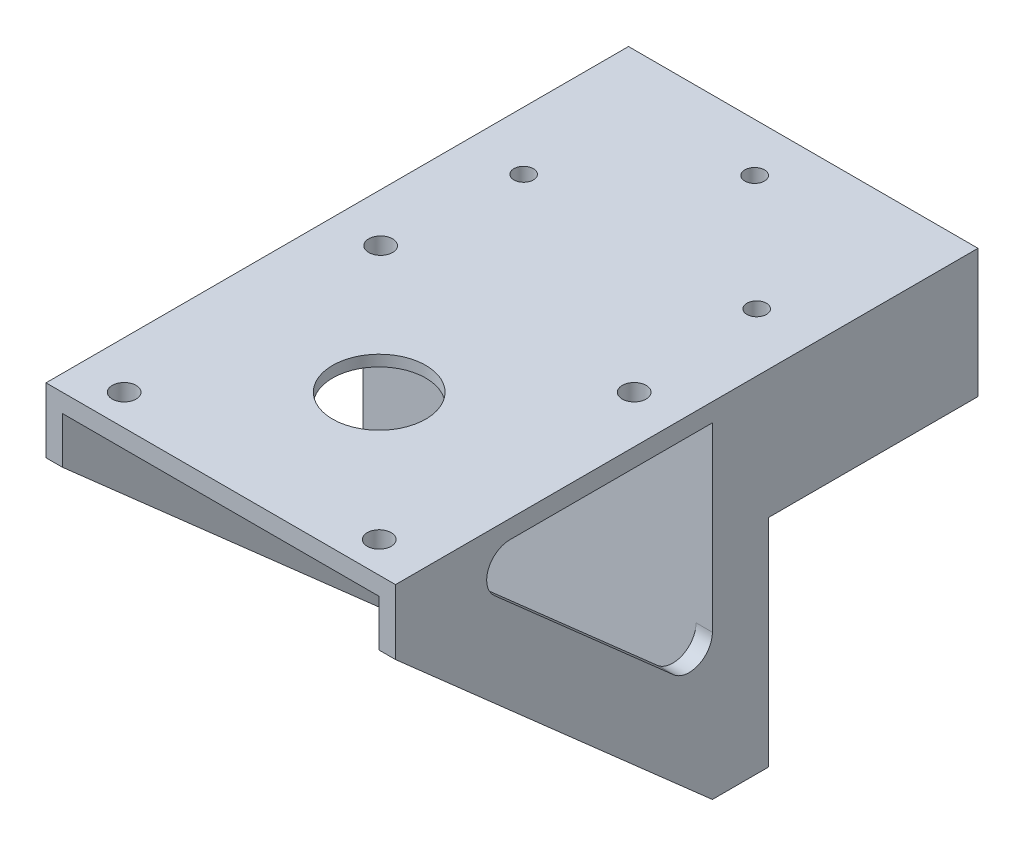
ISO-10303-21;
HEADER;
FILE_DESCRIPTION(('STEP AP214'),'2;1');
FILE_NAME('part.step','',(''),(''),'','','');
FILE_SCHEMA(('AUTOMOTIVE_DESIGN { 1 0 10303 214 1 1 1 1 }'));
ENDSEC;
DATA;
#1=APPLICATION_CONTEXT('core data for automotive mechanical design processes');
#2=APPLICATION_PROTOCOL_DEFINITION('international standard','automotive_design',2000,#1);
#3=PRODUCT_CONTEXT('',#1,'mechanical');
#4=PRODUCT('Part','Part','',(#3));
#5=PRODUCT_RELATED_PRODUCT_CATEGORY('part','',(#4));
#6=PRODUCT_DEFINITION_FORMATION('','',#4);
#7=PRODUCT_DEFINITION_CONTEXT('part definition',#1,'design');
#8=PRODUCT_DEFINITION('design','',#6,#7);
#9=PRODUCT_DEFINITION_SHAPE('','',#8);
#10=(LENGTH_UNIT() NAMED_UNIT(*) SI_UNIT(.MILLI.,.METRE.));
#11=(NAMED_UNIT(*) PLANE_ANGLE_UNIT() SI_UNIT($,.RADIAN.));
#12=(NAMED_UNIT(*) SI_UNIT($,.STERADIAN.) SOLID_ANGLE_UNIT());
#13=UNCERTAINTY_MEASURE_WITH_UNIT(LENGTH_MEASURE(1.E-05),#10,'distance_accuracy_value','');
#14=(GEOMETRIC_REPRESENTATION_CONTEXT(3) GLOBAL_UNCERTAINTY_ASSIGNED_CONTEXT((#13)) GLOBAL_UNIT_ASSIGNED_CONTEXT((#10,
#11,#12)) REPRESENTATION_CONTEXT('',''));
#15=CARTESIAN_POINT('',(0.,0.,0.));
#16=DIRECTION('',(0.,0.,1.));
#17=DIRECTION('',(1.,0.,0.));
#18=AXIS2_PLACEMENT_3D('',#15,#16,#17);
#19=CARTESIAN_POINT('',(47.625,5.,0.));
#20=DIRECTION('',(-1.,0.,0.));
#21=DIRECTION('',(0.,0.,1.));
#22=AXIS2_PLACEMENT_3D('',#19,#20,#21);
#23=PLANE('',#22);
#24=DIRECTION('',(0.,0.,1.));
#25=VECTOR('',#24,1.);
#26=CARTESIAN_POINT('',(47.625,-30.,-111.125));
#27=LINE('',#26,#25);
#28=CARTESIAN_POINT('',(47.625,-30.,-111.125));
#29=VERTEX_POINT('',#28);
#30=CARTESIAN_POINT('',(47.625,-30.,-53.975));
#31=VERTEX_POINT('',#30);
#32=EDGE_CURVE('E225',#29,#31,#27,.T.);
#33=ORIENTED_EDGE('',*,*,#32,.F.);
#34=DIRECTION('',(0.,-1.,0.));
#35=VECTOR('',#34,1.);
#36=CARTESIAN_POINT('',(47.625,5.,-111.125));
#37=LINE('',#36,#35);
#38=CARTESIAN_POINT('',(47.625,5.,-111.125));
#39=VERTEX_POINT('',#38);
#40=EDGE_CURVE('E211',#39,#29,#37,.T.);
#41=ORIENTED_EDGE('',*,*,#40,.F.);
#42=DIRECTION('',(0.,0.,-1.));
#43=VECTOR('',#42,1.);
#44=CARTESIAN_POINT('',(47.625,5.,0.));
#45=LINE('',#44,#43);
#46=CARTESIAN_POINT('',(47.625,5.,47.625));
#47=VERTEX_POINT('',#46);
#48=EDGE_CURVE('E365',#47,#39,#45,.T.);
#49=ORIENTED_EDGE('',*,*,#48,.F.);
#50=DIRECTION('',(0.,-1.,0.));
#51=VECTOR('',#50,1.);
#52=CARTESIAN_POINT('',(47.625,5.,47.625));
#53=LINE('',#52,#51);
#54=CARTESIAN_POINT('',(47.625,-12.7,47.625));
#55=VERTEX_POINT('',#54);
#56=EDGE_CURVE('E221',#47,#55,#53,.T.);
#57=ORIENTED_EDGE('',*,*,#56,.T.);
#58=DIRECTION('',(0.,0.661621637086846,0.749837855365093));
#59=VECTOR('',#58,1.);
#60=CARTESIAN_POINT('',(47.625,-88.9,-38.735));
#61=LINE('',#60,#59);
#62=CARTESIAN_POINT('',(47.625,-88.9,-38.735));
#63=VERTEX_POINT('',#62);
#64=EDGE_CURVE('E286',#63,#55,#61,.T.);
#65=ORIENTED_EDGE('',*,*,#64,.F.);
#66=DIRECTION('',(0.,0.,1.));
#67=VECTOR('',#66,1.);
#68=CARTESIAN_POINT('',(47.625,-88.9,0.));
#69=LINE('',#68,#67);
#70=CARTESIAN_POINT('',(47.625,-88.9,-53.975));
#71=VERTEX_POINT('',#70);
#72=EDGE_CURVE('E320',#71,#63,#69,.T.);
#73=ORIENTED_EDGE('',*,*,#72,.F.);
#74=DIRECTION('',(0.,1.,0.));
#75=VECTOR('',#74,1.);
#76=CARTESIAN_POINT('',(47.625,-88.9,-53.975));
#77=LINE('',#76,#75);
#78=EDGE_CURVE('E228',#71,#31,#77,.T.);
#79=ORIENTED_EDGE('',*,*,#78,.T.);
#80=EDGE_LOOP('',(#33,#41,#49,#57,#65,#73,#79));
#81=FACE_BOUND('',#80,.T.);
#82=DIRECTION('',(0.,-1.,0.));
#83=VECTOR('',#82,1.);
#84=CARTESIAN_POINT('',(47.625,0.,-38.735));
#85=LINE('',#84,#83);
#86=CARTESIAN_POINT('',(47.625,0.,-38.735));
#87=VERTEX_POINT('',#86);
#88=CARTESIAN_POINT('',(47.625,-49.423068842545,-38.735));
#89=VERTEX_POINT('',#88);
#90=EDGE_CURVE('E266',#87,#89,#85,.T.);
#91=ORIENTED_EDGE('',*,*,#90,.T.);
#92=CARTESIAN_POINT('',(47.625,-49.423068842545,-32.385));
#93=DIRECTION('',(-1.,0.,0.));
#94=DIRECTION('',(0.,0.,1.));
#95=AXIS2_PLACEMENT_3D('',#92,#93,#94);
#96=CIRCLE('',#95,6.35);
#97=CARTESIAN_POINT('',(47.625,-54.1845392241133,-28.1837026044985));
#98=VERTEX_POINT('',#97);
#99=EDGE_CURVE('E418',#89,#98,#96,.T.);
#100=ORIENTED_EDGE('',*,*,#99,.T.);
#101=DIRECTION('',(0.,0.661621637086846,0.749837855365093));
#102=VECTOR('',#101,1.);
#103=CARTESIAN_POINT('',(47.625,-16.4834390498475,14.544210926336));
#104=LINE('',#103,#102);
#105=CARTESIAN_POINT('',(47.625,-11.1114703815683,20.6324420837191));
#106=VERTEX_POINT('',#105);
#107=EDGE_CURVE('E258',#98,#106,#104,.T.);
#108=ORIENTED_EDGE('',*,*,#107,.T.);
#109=CARTESIAN_POINT('',(47.625,-6.35,16.4311446882176));
#110=DIRECTION('',(-1.,0.,0.));
#111=DIRECTION('',(0.,0.,1.));
#112=AXIS2_PLACEMENT_3D('',#109,#110,#111);
#113=CIRCLE('',#112,6.35);
#114=CARTESIAN_POINT('',(47.625,0.,16.4311446882176));
#115=VERTEX_POINT('',#114);
#116=EDGE_CURVE('E411',#106,#115,#113,.T.);
#117=ORIENTED_EDGE('',*,*,#116,.T.);
#118=DIRECTION('',(0.,0.,-1.));
#119=VECTOR('',#118,1.);
#120=CARTESIAN_POINT('',(47.625,0.,0.));
#121=LINE('',#120,#119);
#122=EDGE_CURVE('E263',#115,#87,#121,.T.);
#123=ORIENTED_EDGE('',*,*,#122,.T.);
#124=EDGE_LOOP('',(#91,#100,#108,#117,#123));
#125=FACE_BOUND('',#124,.T.);
#126=ADVANCED_FACE('F41',(#81,#125),#23,.F.);
#127=CARTESIAN_POINT('',(43.18,-88.9,0.));
#128=DIRECTION('',(1.,0.,0.));
#129=DIRECTION('',(0.,0.,-1.));
#130=AXIS2_PLACEMENT_3D('',#127,#128,#129);
#131=PLANE('',#130);
#132=DIRECTION('',(0.,0.,-1.));
#133=VECTOR('',#132,1.);
#134=CARTESIAN_POINT('',(43.18,0.,0.));
#135=LINE('',#134,#133);
#136=CARTESIAN_POINT('',(43.18,0.,47.625));
#137=VERTEX_POINT('',#136);
#138=CARTESIAN_POINT('',(43.18,0.,16.4311446882176));
#139=VERTEX_POINT('',#138);
#140=EDGE_CURVE('E304',#137,#139,#135,.T.);
#141=ORIENTED_EDGE('',*,*,#140,.T.);
#142=CARTESIAN_POINT('',(43.18,-6.35,16.4311446882176));
#143=DIRECTION('',(1.,0.,0.));
#144=DIRECTION('',(0.,0.,-1.));
#145=AXIS2_PLACEMENT_3D('',#142,#143,#144);
#146=CIRCLE('',#145,6.35);
#147=CARTESIAN_POINT('',(43.18,-11.1114703815683,20.6324420837191));
#148=VERTEX_POINT('',#147);
#149=EDGE_CURVE('E408',#139,#148,#146,.T.);
#150=ORIENTED_EDGE('',*,*,#149,.T.);
#151=DIRECTION('',(0.,-0.661621637086846,-0.749837855365093));
#152=VECTOR('',#151,1.);
#153=CARTESIAN_POINT('',(43.18,-16.4834390498475,14.544210926336));
#154=LINE('',#153,#152);
#155=CARTESIAN_POINT('',(43.18,-54.1845392241133,-28.1837026044985));
#156=VERTEX_POINT('',#155);
#157=EDGE_CURVE('E254',#148,#156,#154,.T.);
#158=ORIENTED_EDGE('',*,*,#157,.T.);
#159=CARTESIAN_POINT('',(43.18,-49.423068842545,-32.385));
#160=DIRECTION('',(1.,0.,0.));
#161=DIRECTION('',(0.,0.,-1.));
#162=AXIS2_PLACEMENT_3D('',#159,#160,#161);
#163=CIRCLE('',#162,6.35);
#164=CARTESIAN_POINT('',(43.18,-49.423068842545,-38.735));
#165=VERTEX_POINT('',#164);
#166=EDGE_CURVE('E414',#156,#165,#163,.T.);
#167=ORIENTED_EDGE('',*,*,#166,.T.);
#168=DIRECTION('',(0.,1.,0.));
#169=VECTOR('',#168,1.);
#170=CARTESIAN_POINT('',(43.18,-88.9,-38.735));
#171=LINE('',#170,#169);
#172=CARTESIAN_POINT('',(43.18,-88.9,-38.735));
#173=VERTEX_POINT('',#172);
#174=EDGE_CURVE('E349',#173,#165,#171,.T.);
#175=ORIENTED_EDGE('',*,*,#174,.F.);
#176=DIRECTION('',(0.,-0.661621637086846,-0.749837855365093));
#177=VECTOR('',#176,1.);
#178=CARTESIAN_POINT('',(43.18,-88.9,-38.735));
#179=LINE('',#178,#177);
#180=CARTESIAN_POINT('',(43.18,-12.7,47.625));
#181=VERTEX_POINT('',#180);
#182=EDGE_CURVE('E307',#181,#173,#179,.T.);
#183=ORIENTED_EDGE('',*,*,#182,.F.);
#184=DIRECTION('',(0.,1.,0.));
#185=VECTOR('',#184,1.);
#186=CARTESIAN_POINT('',(43.18,-88.9,47.625));
#187=LINE('',#186,#185);
#188=EDGE_CURVE('E352',#181,#137,#187,.T.);
#189=ORIENTED_EDGE('',*,*,#188,.T.);
#190=EDGE_LOOP('',(#141,#150,#158,#167,#175,#183,#189));
#191=FACE_BOUND('',#190,.T.);
#192=ADVANCED_FACE('F460',(#191),#131,.F.);
#193=CARTESIAN_POINT('',(-47.625,5.,0.));
#194=DIRECTION('',(-1.,0.,0.));
#195=DIRECTION('',(0.,0.,1.));
#196=AXIS2_PLACEMENT_3D('',#193,#194,#195);
#197=PLANE('',#196);
#198=DIRECTION('',(0.,-1.,0.));
#199=VECTOR('',#198,1.);
#200=CARTESIAN_POINT('',(-47.625,5.,-111.125));
#201=LINE('',#200,#199);
#202=CARTESIAN_POINT('',(-47.625,5.,-111.125));
#203=VERTEX_POINT('',#202);
#204=CARTESIAN_POINT('',(-47.625,-30.,-111.125));
#205=VERTEX_POINT('',#204);
#206=EDGE_CURVE('E222',#203,#205,#201,.T.);
#207=ORIENTED_EDGE('',*,*,#206,.T.);
#208=DIRECTION('',(0.,0.,-1.));
#209=VECTOR('',#208,1.);
#210=CARTESIAN_POINT('',(-47.625,-30.,-53.975));
#211=LINE('',#210,#209);
#212=CARTESIAN_POINT('',(-47.625,-30.,-53.975));
#213=VERTEX_POINT('',#212);
#214=EDGE_CURVE('E235',#213,#205,#211,.T.);
#215=ORIENTED_EDGE('',*,*,#214,.F.);
#216=DIRECTION('',(0.,1.,0.));
#217=VECTOR('',#216,1.);
#218=CARTESIAN_POINT('',(-47.625,-88.9,-53.975));
#219=LINE('',#218,#217);
#220=CARTESIAN_POINT('',(-47.625,-88.9,-53.975));
#221=VERTEX_POINT('',#220);
#222=EDGE_CURVE('E332',#221,#213,#219,.T.);
#223=ORIENTED_EDGE('',*,*,#222,.F.);
#224=DIRECTION('',(0.,0.,-1.));
#225=VECTOR('',#224,1.);
#226=CARTESIAN_POINT('',(-47.625,-88.9,0.));
#227=LINE('',#226,#225);
#228=CARTESIAN_POINT('',(-47.625,-88.9,-38.735));
#229=VERTEX_POINT('',#228);
#230=EDGE_CURVE('E329',#229,#221,#227,.T.);
#231=ORIENTED_EDGE('',*,*,#230,.F.);
#232=DIRECTION('',(0.,-0.661621637086846,-0.749837855365093));
#233=VECTOR('',#232,1.);
#234=CARTESIAN_POINT('',(-47.625,-88.9,-38.735));
#235=LINE('',#234,#233);
#236=CARTESIAN_POINT('',(-47.625,-12.7,47.625));
#237=VERTEX_POINT('',#236);
#238=EDGE_CURVE('E301',#237,#229,#235,.T.);
#239=ORIENTED_EDGE('',*,*,#238,.F.);
#240=DIRECTION('',(0.,-1.,0.));
#241=VECTOR('',#240,1.);
#242=CARTESIAN_POINT('',(-47.625,5.,47.625));
#243=LINE('',#242,#241);
#244=CARTESIAN_POINT('',(-47.625,5.,47.625));
#245=VERTEX_POINT('',#244);
#246=EDGE_CURVE('E377',#245,#237,#243,.T.);
#247=ORIENTED_EDGE('',*,*,#246,.F.);
#248=DIRECTION('',(0.,0.,-1.));
#249=VECTOR('',#248,1.);
#250=CARTESIAN_POINT('',(-47.625,5.,0.));
#251=LINE('',#250,#249);
#252=EDGE_CURVE('E358',#245,#203,#251,.T.);
#253=ORIENTED_EDGE('',*,*,#252,.T.);
#254=EDGE_LOOP('',(#207,#215,#223,#231,#239,#247,#253));
#255=FACE_BOUND('',#254,.T.);
#256=DIRECTION('',(0.,0.,1.));
#257=VECTOR('',#256,1.);
#258=CARTESIAN_POINT('',(-47.625,0.,0.));
#259=LINE('',#258,#257);
#260=CARTESIAN_POINT('',(-47.625,0.,-38.735));
#261=VERTEX_POINT('',#260);
#262=CARTESIAN_POINT('',(-47.625,0.,16.4311446882176));
#263=VERTEX_POINT('',#262);
#264=EDGE_CURVE('E273',#261,#263,#259,.T.);
#265=ORIENTED_EDGE('',*,*,#264,.T.);
#266=CARTESIAN_POINT('',(-47.625,-6.35,16.4311446882176));
#267=DIRECTION('',(-1.,0.,0.));
#268=DIRECTION('',(0.,0.,1.));
#269=AXIS2_PLACEMENT_3D('',#266,#267,#268);
#270=CIRCLE('',#269,6.35);
#271=CARTESIAN_POINT('',(-47.625,-11.1114703815683,20.6324420837191));
#272=VERTEX_POINT('',#271);
#273=EDGE_CURVE('E11',#263,#272,#270,.F.);
#274=ORIENTED_EDGE('',*,*,#273,.T.);
#275=DIRECTION('',(0.,-0.661621637086846,-0.749837855365093));
#276=VECTOR('',#275,1.);
#277=CARTESIAN_POINT('',(-47.625,-16.4834390498475,14.544210926336));
#278=LINE('',#277,#276);
#279=CARTESIAN_POINT('',(-47.625,-54.1845392241133,-28.1837026044985));
#280=VERTEX_POINT('',#279);
#281=EDGE_CURVE('E259',#272,#280,#278,.T.);
#282=ORIENTED_EDGE('',*,*,#281,.T.);
#283=CARTESIAN_POINT('',(-47.625,-49.423068842545,-32.385));
#284=DIRECTION('',(-1.,0.,0.));
#285=DIRECTION('',(0.,0.,1.));
#286=AXIS2_PLACEMENT_3D('',#283,#284,#285);
#287=CIRCLE('',#286,6.35);
#288=CARTESIAN_POINT('',(-47.625,-49.423068842545,-38.735));
#289=VERTEX_POINT('',#288);
#290=EDGE_CURVE('E424',#280,#289,#287,.F.);
#291=ORIENTED_EDGE('',*,*,#290,.T.);
#292=DIRECTION('',(0.,1.,0.));
#293=VECTOR('',#292,1.);
#294=CARTESIAN_POINT('',(-47.625,0.,-38.735));
#295=LINE('',#294,#293);
#296=EDGE_CURVE('E253',#289,#261,#295,.T.);
#297=ORIENTED_EDGE('',*,*,#296,.T.);
#298=EDGE_LOOP('',(#265,#274,#282,#291,#297));
#299=FACE_BOUND('',#298,.T.);
#300=ADVANCED_FACE('F443',(#255,#299),#197,.T.);
#301=CARTESIAN_POINT('',(0.,5.,47.625));
#302=DIRECTION('',(0.,0.,-1.));
#303=DIRECTION('',(-1.,0.,0.));
#304=AXIS2_PLACEMENT_3D('',#301,#302,#303);
#305=PLANE('',#304);
#306=DIRECTION('',(1.,0.,0.));
#307=VECTOR('',#306,1.);
#308=CARTESIAN_POINT('',(-47.626,-12.7,47.625));
#309=LINE('',#308,#307);
#310=CARTESIAN_POINT('',(-43.18,-12.7,47.625));
#311=VERTEX_POINT('',#310);
#312=EDGE_CURVE('E293',#237,#311,#309,.T.);
#313=ORIENTED_EDGE('',*,*,#312,.T.);
#314=DIRECTION('',(0.,1.,0.));
#315=VECTOR('',#314,1.);
#316=CARTESIAN_POINT('',(-43.18,-88.9,47.625));
#317=LINE('',#316,#315);
#318=CARTESIAN_POINT('',(-43.18,0.,47.625));
#319=VERTEX_POINT('',#318);
#320=EDGE_CURVE('E343',#311,#319,#317,.T.);
#321=ORIENTED_EDGE('',*,*,#320,.T.);
#322=DIRECTION('',(1.,0.,0.));
#323=VECTOR('',#322,1.);
#324=CARTESIAN_POINT('',(0.,0.,47.625));
#325=LINE('',#324,#323);
#326=EDGE_CURVE('E357',#319,#137,#325,.T.);
#327=ORIENTED_EDGE('',*,*,#326,.T.);
#328=ORIENTED_EDGE('',*,*,#188,.F.);
#329=DIRECTION('',(-1.,0.,0.));
#330=VECTOR('',#329,1.);
#331=CARTESIAN_POINT('',(47.626,-12.7,47.625));
#332=LINE('',#331,#330);
#333=EDGE_CURVE('E310',#55,#181,#332,.T.);
#334=ORIENTED_EDGE('',*,*,#333,.F.);
#335=ORIENTED_EDGE('',*,*,#56,.F.);
#336=DIRECTION('',(1.,0.,0.));
#337=VECTOR('',#336,1.);
#338=CARTESIAN_POINT('',(0.,5.,47.625));
#339=LINE('',#338,#337);
#340=EDGE_CURVE('E362',#245,#47,#339,.T.);
#341=ORIENTED_EDGE('',*,*,#340,.F.);
#342=ORIENTED_EDGE('',*,*,#246,.T.);
#343=EDGE_LOOP('',(#313,#321,#327,#328,#334,#335,#341,#342));
#344=FACE_BOUND('',#343,.T.);
#345=ADVANCED_FACE('F486',(#344),#305,.F.);
#346=CARTESIAN_POINT('',(-43.18,-88.9,0.));
#347=DIRECTION('',(1.,0.,0.));
#348=DIRECTION('',(0.,0.,-1.));
#349=AXIS2_PLACEMENT_3D('',#346,#347,#348);
#350=PLANE('',#349);
#351=DIRECTION('',(0.,-0.661621637086846,-0.749837855365093));
#352=VECTOR('',#351,1.);
#353=CARTESIAN_POINT('',(-43.18,-16.4834390498475,14.544210926336));
#354=LINE('',#353,#352);
#355=CARTESIAN_POINT('',(-43.18,-11.1114703815683,20.6324420837191));
#356=VERTEX_POINT('',#355);
#357=CARTESIAN_POINT('',(-43.18,-54.1845392241133,-28.1837026044985));
#358=VERTEX_POINT('',#357);
#359=EDGE_CURVE('E277',#356,#358,#354,.T.);
#360=ORIENTED_EDGE('',*,*,#359,.F.);
#361=CARTESIAN_POINT('',(-43.18,-6.35,16.4311446882176));
#362=DIRECTION('',(1.,0.,0.));
#363=DIRECTION('',(0.,0.,-1.));
#364=AXIS2_PLACEMENT_3D('',#361,#362,#363);
#365=CIRCLE('',#364,6.35);
#366=CARTESIAN_POINT('',(-43.18,0.,16.4311446882176));
#367=VERTEX_POINT('',#366);
#368=EDGE_CURVE('E50',#356,#367,#365,.F.);
#369=ORIENTED_EDGE('',*,*,#368,.T.);
#370=DIRECTION('',(0.,0.,-1.));
#371=VECTOR('',#370,1.);
#372=CARTESIAN_POINT('',(-43.18,0.,0.));
#373=LINE('',#372,#371);
#374=EDGE_CURVE('E321',#319,#367,#373,.T.);
#375=ORIENTED_EDGE('',*,*,#374,.F.);
#376=ORIENTED_EDGE('',*,*,#320,.F.);
#377=DIRECTION('',(0.,0.661621637086846,0.749837855365093));
#378=VECTOR('',#377,1.);
#379=CARTESIAN_POINT('',(-43.18,-88.9,-38.735));
#380=LINE('',#379,#378);
#381=CARTESIAN_POINT('',(-43.18,-88.9,-38.735));
#382=VERTEX_POINT('',#381);
#383=EDGE_CURVE('E298',#382,#311,#380,.T.);
#384=ORIENTED_EDGE('',*,*,#383,.F.);
#385=DIRECTION('',(0.,1.,0.));
#386=VECTOR('',#385,1.);
#387=CARTESIAN_POINT('',(-43.18,-88.9,-38.735));
#388=LINE('',#387,#386);
#389=CARTESIAN_POINT('',(-43.18,-49.423068842545,-38.735));
#390=VERTEX_POINT('',#389);
#391=EDGE_CURVE('E346',#382,#390,#388,.T.);
#392=ORIENTED_EDGE('',*,*,#391,.T.);
#393=CARTESIAN_POINT('',(-43.18,-49.423068842545,-32.385));
#394=DIRECTION('',(1.,0.,0.));
#395=DIRECTION('',(0.,0.,-1.));
#396=AXIS2_PLACEMENT_3D('',#393,#394,#395);
#397=CIRCLE('',#396,6.35);
#398=EDGE_CURVE('E421',#390,#358,#397,.F.);
#399=ORIENTED_EDGE('',*,*,#398,.T.);
#400=EDGE_LOOP('',(#360,#369,#375,#376,#384,#392,#399));
#401=FACE_BOUND('',#400,.T.);
#402=ADVANCED_FACE('F432',(#401),#350,.T.);
#403=CARTESIAN_POINT('',(0.,-88.9,0.));
#404=DIRECTION('',(0.,-1.,0.));
#405=DIRECTION('',(0.,0.,-1.));
#406=AXIS2_PLACEMENT_3D('',#403,#404,#405);
#407=PLANE('',#406);
#408=DIRECTION('',(1.,0.,0.));
#409=VECTOR('',#408,1.);
#410=CARTESIAN_POINT('',(0.,-88.9,-38.735));
#411=LINE('',#410,#409);
#412=EDGE_CURVE('E325',#382,#173,#411,.T.);
#413=ORIENTED_EDGE('',*,*,#412,.F.);
#414=DIRECTION('',(1.,0.,0.));
#415=VECTOR('',#414,1.);
#416=CARTESIAN_POINT('',(-47.626,-88.9,-38.735));
#417=LINE('',#416,#415);
#418=EDGE_CURVE('E290',#229,#382,#417,.T.);
#419=ORIENTED_EDGE('',*,*,#418,.F.);
#420=ORIENTED_EDGE('',*,*,#230,.T.);
#421=DIRECTION('',(-1.,0.,0.));
#422=VECTOR('',#421,1.);
#423=CARTESIAN_POINT('',(0.,-88.9,-53.975));
#424=LINE('',#423,#422);
#425=EDGE_CURVE('E316',#71,#221,#424,.T.);
#426=ORIENTED_EDGE('',*,*,#425,.F.);
#427=ORIENTED_EDGE('',*,*,#72,.T.);
#428=DIRECTION('',(-1.,0.,0.));
#429=VECTOR('',#428,1.);
#430=CARTESIAN_POINT('',(47.626,-88.9,-38.735));
#431=LINE('',#430,#429);
#432=EDGE_CURVE('E294',#63,#173,#431,.T.);
#433=ORIENTED_EDGE('',*,*,#432,.T.);
#434=EDGE_LOOP('',(#413,#419,#420,#426,#427,#433));
#435=FACE_BOUND('',#434,.T.);
#436=ADVANCED_FACE('F476',(#435),#407,.T.);
#437=CARTESIAN_POINT('',(0.,5.,-111.125));
#438=DIRECTION('',(0.,0.,-1.));
#439=DIRECTION('',(-1.,0.,0.));
#440=AXIS2_PLACEMENT_3D('',#437,#438,#439);
#441=PLANE('',#440);
#442=ORIENTED_EDGE('',*,*,#40,.T.);
#443=DIRECTION('',(1.,0.,0.));
#444=VECTOR('',#443,1.);
#445=CARTESIAN_POINT('',(-47.625,-30.,-111.125));
#446=LINE('',#445,#444);
#447=EDGE_CURVE('E215',#205,#29,#446,.T.);
#448=ORIENTED_EDGE('',*,*,#447,.F.);
#449=ORIENTED_EDGE('',*,*,#206,.F.);
#450=DIRECTION('',(1.,0.,0.));
#451=VECTOR('',#450,1.);
#452=CARTESIAN_POINT('',(0.,5.,-111.125));
#453=LINE('',#452,#451);
#454=EDGE_CURVE('E217',#203,#39,#453,.T.);
#455=ORIENTED_EDGE('',*,*,#454,.T.);
#456=EDGE_LOOP('',(#442,#448,#449,#455));
#457=FACE_BOUND('',#456,.T.);
#458=ADVANCED_FACE('F213',(#457),#441,.T.);
#459=CARTESIAN_POINT('',(0.,5.,0.));
#460=DIRECTION('',(0.,1.,0.));
#461=DIRECTION('',(0.,0.,1.));
#462=AXIS2_PLACEMENT_3D('',#459,#460,#461);
#463=PLANE('',#462);
#464=CARTESIAN_POINT('',(34.7500000000023,5.,39.1949999999994));
#465=DIRECTION('',(0.,1.,0.));
#466=DIRECTION('',(0.,0.,1.));
#467=AXIS2_PLACEMENT_3D('',#464,#465,#466);
#468=CIRCLE('',#467,3.25);
#469=CARTESIAN_POINT('',(34.7500000000023,5.,42.4449999999994));
#470=VERTEX_POINT('',#469);
#471=EDGE_CURVE('E696',#470,#470,#468,.F.);
#472=ORIENTED_EDGE('',*,*,#471,.T.);
#473=EDGE_LOOP('',(#472));
#474=FACE_BOUND('',#473,.T.);
#475=CARTESIAN_POINT('',(-34.396603139129,5.,-30.34702737021));
#476=DIRECTION('',(0.,1.,0.));
#477=DIRECTION('',(0.,0.,1.));
#478=AXIS2_PLACEMENT_3D('',#475,#476,#477);
#479=CIRCLE('',#478,3.25);
#480=CARTESIAN_POINT('',(-34.396603139129,5.,-27.09702737021));
#481=VERTEX_POINT('',#480);
#482=EDGE_CURVE('E687',#481,#481,#479,.F.);
#483=ORIENTED_EDGE('',*,*,#482,.T.);
#484=EDGE_LOOP('',(#483));
#485=FACE_BOUND('',#484,.T.);
#486=CARTESIAN_POINT('',(34.7500000000023,5.,-30.3050000000006));
#487=DIRECTION('',(0.,1.,0.));
#488=DIRECTION('',(0.,0.,1.));
#489=AXIS2_PLACEMENT_3D('',#486,#487,#488);
#490=CIRCLE('',#489,3.25);
#491=CARTESIAN_POINT('',(34.7500000000023,5.,-27.0550000000006));
#492=VERTEX_POINT('',#491);
#493=EDGE_CURVE('E702',#492,#492,#490,.F.);
#494=ORIENTED_EDGE('',*,*,#493,.T.);
#495=EDGE_LOOP('',(#494));
#496=FACE_BOUND('',#495,.T.);
#497=CARTESIAN_POINT('',(-34.7499999999977,5.,39.1949999999994));
#498=DIRECTION('',(0.,1.,0.));
#499=DIRECTION('',(0.,0.,1.));
#500=AXIS2_PLACEMENT_3D('',#497,#498,#499);
#501=CIRCLE('',#500,3.25);
#502=CARTESIAN_POINT('',(-34.7499999999977,5.,42.4449999999994));
#503=VERTEX_POINT('',#502);
#504=EDGE_CURVE('E679',#503,#503,#501,.F.);
#505=ORIENTED_EDGE('',*,*,#504,.T.);
#506=EDGE_LOOP('',(#505));
#507=FACE_BOUND('',#506,.T.);
#508=CARTESIAN_POINT('',(2.28983498828939E-12,5.,4.44499999999938));
#509=DIRECTION('',(0.,1.,0.));
#510=DIRECTION('',(0.,0.,1.));
#511=AXIS2_PLACEMENT_3D('',#508,#509,#510);
#512=CIRCLE('',#511,12.7);
#513=CARTESIAN_POINT('',(2.28983498828939E-12,5.,17.1449999999994));
#514=VERTEX_POINT('',#513);
#515=EDGE_CURVE('E665',#514,#514,#512,.T.);
#516=ORIENTED_EDGE('',*,*,#515,.F.);
#517=EDGE_LOOP('',(#516));
#518=FACE_BOUND('',#517,.T.);
#519=CARTESIAN_POINT('',(0.,5.,-97.8729456952294));
#520=DIRECTION('',(0.,1.,0.));
#521=DIRECTION('',(0.,0.,1.));
#522=AXIS2_PLACEMENT_3D('',#519,#520,#521);
#523=CIRCLE('',#522,2.665000004);
#524=CARTESIAN_POINT('',(0.,5.,-95.2079456912294));
#525=VERTEX_POINT('',#524);
#526=EDGE_CURVE('E243',#525,#525,#523,.F.);
#527=ORIENTED_EDGE('',*,*,#526,.T.);
#528=EDGE_LOOP('',(#527));
#529=FACE_BOUND('',#528,.T.);
#530=CARTESIAN_POINT('',(-31.75,5.,-66.675));
#531=DIRECTION('',(0.,1.,0.));
#532=DIRECTION('',(0.,0.,1.));
#533=AXIS2_PLACEMENT_3D('',#530,#531,#532);
#534=CIRCLE('',#533,2.665000004);
#535=CARTESIAN_POINT('',(-31.75,5.,-64.009999996));
#536=VERTEX_POINT('',#535);
#537=EDGE_CURVE('E659',#536,#536,#534,.F.);
#538=ORIENTED_EDGE('',*,*,#537,.T.);
#539=EDGE_LOOP('',(#538));
#540=FACE_BOUND('',#539,.T.);
#541=CARTESIAN_POINT('',(31.75,5.,-66.675));
#542=DIRECTION('',(0.,1.,0.));
#543=DIRECTION('',(0.,0.,1.));
#544=AXIS2_PLACEMENT_3D('',#541,#542,#543);
#545=CIRCLE('',#544,2.665000004);
#546=CARTESIAN_POINT('',(31.75,5.,-64.009999996));
#547=VERTEX_POINT('',#546);
#548=EDGE_CURVE('E246',#547,#547,#545,.F.);
#549=ORIENTED_EDGE('',*,*,#548,.T.);
#550=EDGE_LOOP('',(#549));
#551=FACE_BOUND('',#550,.T.);
#552=ORIENTED_EDGE('',*,*,#252,.F.);
#553=ORIENTED_EDGE('',*,*,#340,.T.);
#554=ORIENTED_EDGE('',*,*,#48,.T.);
#555=ORIENTED_EDGE('',*,*,#454,.F.);
#556=EDGE_LOOP('',(#552,#553,#554,#555));
#557=FACE_BOUND('',#556,.T.);
#558=ADVANCED_FACE('F497',(#474,#485,#496,#507,#518,#529,#540,#551,#557),#463,.T.);
#559=CARTESIAN_POINT('',(0.,0.,0.));
#560=DIRECTION('',(0.,1.,0.));
#561=DIRECTION('',(0.,0.,1.));
#562=AXIS2_PLACEMENT_3D('',#559,#560,#561);
#563=PLANE('',#562);
#564=CARTESIAN_POINT('',(34.7500000000023,0.,39.1949999999994));
#565=DIRECTION('',(0.,-1.,0.));
#566=DIRECTION('',(0.,0.,-1.));
#567=AXIS2_PLACEMENT_3D('',#564,#565,#566);
#568=CIRCLE('',#567,3.25);
#569=CARTESIAN_POINT('',(34.7500000000023,0.,35.9449999999994));
#570=VERTEX_POINT('',#569);
#571=EDGE_CURVE('E683',#570,#570,#568,.T.);
#572=ORIENTED_EDGE('',*,*,#571,.F.);
#573=EDGE_LOOP('',(#572));
#574=FACE_BOUND('',#573,.T.);
#575=CARTESIAN_POINT('',(-34.396603139129,0.,-30.34702737021));
#576=DIRECTION('',(0.,-1.,0.));
#577=DIRECTION('',(0.,0.,-1.));
#578=AXIS2_PLACEMENT_3D('',#575,#576,#577);
#579=CIRCLE('',#578,3.25);
#580=CARTESIAN_POINT('',(-34.396603139129,0.,-33.59702737021));
#581=VERTEX_POINT('',#580);
#582=EDGE_CURVE('E691',#581,#581,#579,.T.);
#583=ORIENTED_EDGE('',*,*,#582,.F.);
#584=EDGE_LOOP('',(#583));
#585=FACE_BOUND('',#584,.T.);
#586=CARTESIAN_POINT('',(34.7500000000023,0.,-30.3050000000006));
#587=DIRECTION('',(0.,-1.,0.));
#588=DIRECTION('',(0.,0.,-1.));
#589=AXIS2_PLACEMENT_3D('',#586,#587,#588);
#590=CIRCLE('',#589,3.25);
#591=CARTESIAN_POINT('',(34.7500000000023,0.,-33.5550000000006));
#592=VERTEX_POINT('',#591);
#593=EDGE_CURVE('E692',#592,#592,#590,.T.);
#594=ORIENTED_EDGE('',*,*,#593,.F.);
#595=EDGE_LOOP('',(#594));
#596=FACE_BOUND('',#595,.T.);
#597=CARTESIAN_POINT('',(-34.7499999999977,0.,39.1949999999994));
#598=DIRECTION('',(0.,-1.,0.));
#599=DIRECTION('',(0.,0.,-1.));
#600=AXIS2_PLACEMENT_3D('',#597,#598,#599);
#601=CIRCLE('',#600,3.25);
#602=CARTESIAN_POINT('',(-34.7499999999977,0.,35.9449999999994));
#603=VERTEX_POINT('',#602);
#604=EDGE_CURVE('E675',#603,#603,#601,.T.);
#605=ORIENTED_EDGE('',*,*,#604,.F.);
#606=EDGE_LOOP('',(#605));
#607=FACE_BOUND('',#606,.T.);
#608=CARTESIAN_POINT('',(0.,0.,4.44499999999999));
#609=DIRECTION('',(0.,-1.,0.));
#610=DIRECTION('',(0.,0.,-1.));
#611=AXIS2_PLACEMENT_3D('',#608,#609,#610);
#612=CIRCLE('',#611,37.5);
#613=CARTESIAN_POINT('',(0.,0.,-33.055));
#614=VERTEX_POINT('',#613);
#615=EDGE_CURVE('E270',#614,#614,#612,.T.);
#616=ORIENTED_EDGE('',*,*,#615,.F.);
#617=EDGE_LOOP('',(#616));
#618=FACE_BOUND('',#617,.T.);
#619=ORIENTED_EDGE('',*,*,#122,.F.);
#620=DIRECTION('',(-1.,0.,0.));
#621=VECTOR('',#620,1.);
#622=CARTESIAN_POINT('',(0.,0.,16.4311446882176));
#623=LINE('',#622,#621);
#624=EDGE_CURVE('E384',#115,#139,#623,.T.);
#625=ORIENTED_EDGE('',*,*,#624,.T.);
#626=ORIENTED_EDGE('',*,*,#140,.F.);
#627=ORIENTED_EDGE('',*,*,#326,.F.);
#628=ORIENTED_EDGE('',*,*,#374,.T.);
#629=DIRECTION('',(1.,0.,0.));
#630=VECTOR('',#629,1.);
#631=CARTESIAN_POINT('',(-47.625,0.,16.4311446882176));
#632=LINE('',#631,#630);
#633=EDGE_CURVE('E381',#367,#263,#632,.F.);
#634=ORIENTED_EDGE('',*,*,#633,.T.);
#635=ORIENTED_EDGE('',*,*,#264,.F.);
#636=DIRECTION('',(1.,0.,0.));
#637=VECTOR('',#636,1.);
#638=CARTESIAN_POINT('',(0.,0.,-38.735));
#639=LINE('',#638,#637);
#640=EDGE_CURVE('E335',#261,#87,#639,.T.);
#641=ORIENTED_EDGE('',*,*,#640,.T.);
#642=EDGE_LOOP('',(#619,#625,#626,#627,#628,#634,#635,#641));
#643=FACE_BOUND('',#642,.T.);
#644=ADVANCED_FACE('F440',(#574,#585,#596,#607,#618,#643),#563,.F.);
#645=CARTESIAN_POINT('',(0.,-88.9,-53.975));
#646=DIRECTION('',(0.,0.,-1.));
#647=DIRECTION('',(-1.,0.,0.));
#648=AXIS2_PLACEMENT_3D('',#645,#646,#647);
#649=PLANE('',#648);
#650=DIRECTION('',(-1.,0.,0.));
#651=VECTOR('',#650,1.);
#652=CARTESIAN_POINT('',(47.625,-30.,-53.975));
#653=LINE('',#652,#651);
#654=EDGE_CURVE('E60',#31,#213,#653,.T.);
#655=ORIENTED_EDGE('',*,*,#654,.F.);
#656=ORIENTED_EDGE('',*,*,#78,.F.);
#657=ORIENTED_EDGE('',*,*,#425,.T.);
#658=ORIENTED_EDGE('',*,*,#222,.T.);
#659=EDGE_LOOP('',(#655,#656,#657,#658));
#660=FACE_BOUND('',#659,.T.);
#661=ADVANCED_FACE('F495',(#660),#649,.T.);
#662=CARTESIAN_POINT('',(0.,-88.9,-38.735));
#663=DIRECTION('',(0.,0.,1.));
#664=DIRECTION('',(1.,0.,0.));
#665=AXIS2_PLACEMENT_3D('',#662,#663,#664);
#666=PLANE('',#665);
#667=ORIENTED_EDGE('',*,*,#174,.T.);
#668=DIRECTION('',(-1.,0.,0.));
#669=VECTOR('',#668,1.);
#670=CARTESIAN_POINT('',(47.625,-49.423068842545,-38.735));
#671=LINE('',#670,#669);
#672=EDGE_CURVE('E399',#165,#89,#671,.F.);
#673=ORIENTED_EDGE('',*,*,#672,.T.);
#674=ORIENTED_EDGE('',*,*,#90,.F.);
#675=ORIENTED_EDGE('',*,*,#640,.F.);
#676=ORIENTED_EDGE('',*,*,#296,.F.);
#677=DIRECTION('',(1.,0.,0.));
#678=VECTOR('',#677,1.);
#679=CARTESIAN_POINT('',(0.,-49.423068842545,-38.735));
#680=LINE('',#679,#678);
#681=EDGE_CURVE('E395',#289,#390,#680,.T.);
#682=ORIENTED_EDGE('',*,*,#681,.T.);
#683=ORIENTED_EDGE('',*,*,#391,.F.);
#684=ORIENTED_EDGE('',*,*,#412,.T.);
#685=EDGE_LOOP('',(#667,#673,#674,#675,#676,#682,#683,#684));
#686=FACE_BOUND('',#685,.T.);
#687=ADVANCED_FACE('F450',(#686),#666,.T.);
#688=CARTESIAN_POINT('',(47.626,-88.9,-38.735));
#689=DIRECTION('',(0.,0.749837855365093,-0.661621637086846));
#690=DIRECTION('',(0.,0.661621637086846,0.749837855365093));
#691=AXIS2_PLACEMENT_3D('',#688,#689,#690);
#692=PLANE('',#691);
#693=ORIENTED_EDGE('',*,*,#64,.T.);
#694=ORIENTED_EDGE('',*,*,#333,.T.);
#695=ORIENTED_EDGE('',*,*,#182,.T.);
#696=ORIENTED_EDGE('',*,*,#432,.F.);
#697=EDGE_LOOP('',(#693,#694,#695,#696));
#698=FACE_BOUND('',#697,.T.);
#699=ADVANCED_FACE('F481',(#698),#692,.F.);
#700=CARTESIAN_POINT('',(-47.626,-88.9,-38.735));
#701=DIRECTION('',(0.,-0.749837855365093,0.661621637086846));
#702=DIRECTION('',(0.,-0.661621637086846,-0.749837855365093));
#703=AXIS2_PLACEMENT_3D('',#700,#701,#702);
#704=PLANE('',#703);
#705=ORIENTED_EDGE('',*,*,#238,.T.);
#706=ORIENTED_EDGE('',*,*,#418,.T.);
#707=ORIENTED_EDGE('',*,*,#383,.T.);
#708=ORIENTED_EDGE('',*,*,#312,.F.);
#709=EDGE_LOOP('',(#705,#706,#707,#708));
#710=FACE_BOUND('',#709,.T.);
#711=ADVANCED_FACE('F491',(#710),#704,.T.);
#712=CARTESIAN_POINT('',(0.,2.,4.44499999999999));
#713=DIRECTION('',(0.,-1.,0.));
#714=DIRECTION('',(0.,0.,-1.));
#715=AXIS2_PLACEMENT_3D('',#712,#713,#714);
#716=CYLINDRICAL_SURFACE('',#715,37.5);
#717=CARTESIAN_POINT('',(0.,2.,4.44499999999999));
#718=DIRECTION('',(0.,-1.,0.));
#719=DIRECTION('',(0.,0.,-1.));
#720=AXIS2_PLACEMENT_3D('',#717,#718,#719);
#721=CIRCLE('',#720,37.5);
#722=CARTESIAN_POINT('',(0.,2.,-33.055));
#723=VERTEX_POINT('',#722);
#724=EDGE_CURVE('E282',#723,#723,#721,.T.);
#725=ORIENTED_EDGE('',*,*,#724,.F.);
#726=EDGE_LOOP('',(#725));
#727=FACE_BOUND('',#726,.T.);
#728=ORIENTED_EDGE('',*,*,#615,.T.);
#729=EDGE_LOOP('',(#728));
#730=FACE_BOUND('',#729,.T.);
#731=ADVANCED_FACE('F542',(#727,#730),#716,.F.);
#732=CARTESIAN_POINT('',(0.,2.,4.44499999999999));
#733=DIRECTION('',(0.,-1.,0.));
#734=DIRECTION('',(0.,0.,-1.));
#735=AXIS2_PLACEMENT_3D('',#732,#733,#734);
#736=PLANE('',#735);
#737=CARTESIAN_POINT('',(2.28983498828939E-12,2.,4.44499999999938));
#738=DIRECTION('',(0.,-1.,0.));
#739=DIRECTION('',(0.,0.,-1.));
#740=AXIS2_PLACEMENT_3D('',#737,#738,#739);
#741=CIRCLE('',#740,12.7);
#742=CARTESIAN_POINT('',(2.28983498828939E-12,2.,-8.25500000000062));
#743=VERTEX_POINT('',#742);
#744=EDGE_CURVE('E671',#743,#743,#741,.F.);
#745=ORIENTED_EDGE('',*,*,#744,.T.);
#746=EDGE_LOOP('',(#745));
#747=FACE_BOUND('',#746,.T.);
#748=ORIENTED_EDGE('',*,*,#724,.T.);
#749=EDGE_LOOP('',(#748));
#750=FACE_BOUND('',#749,.T.);
#751=ADVANCED_FACE('F533',(#747,#750),#736,.T.);
#752=CARTESIAN_POINT('',(-47.626,-16.4834390498475,14.544210926336));
#753=DIRECTION('',(0.,-0.749837855365093,0.661621637086846));
#754=DIRECTION('',(0.,-0.661621637086846,-0.749837855365093));
#755=AXIS2_PLACEMENT_3D('',#752,#753,#754);
#756=PLANE('',#755);
#757=ORIENTED_EDGE('',*,*,#359,.T.);
#758=DIRECTION('',(1.,0.,0.));
#759=VECTOR('',#758,1.);
#760=CARTESIAN_POINT('',(-47.626,-54.1845392241133,-28.1837026044985));
#761=LINE('',#760,#759);
#762=EDGE_CURVE('E71',#358,#280,#761,.F.);
#763=ORIENTED_EDGE('',*,*,#762,.T.);
#764=ORIENTED_EDGE('',*,*,#281,.F.);
#765=DIRECTION('',(1.,0.,0.));
#766=VECTOR('',#765,1.);
#767=CARTESIAN_POINT('',(-43.18,-11.1114703815683,20.6324420837191));
#768=LINE('',#767,#766);
#769=EDGE_CURVE('E402',#272,#356,#768,.T.);
#770=ORIENTED_EDGE('',*,*,#769,.T.);
#771=EDGE_LOOP('',(#757,#763,#764,#770));
#772=FACE_BOUND('',#771,.T.);
#773=ADVANCED_FACE('F531',(#772),#756,.F.);
#774=CARTESIAN_POINT('',(47.626,-16.4834390498475,14.544210926336));
#775=DIRECTION('',(0.,0.749837855365093,-0.661621637086846));
#776=DIRECTION('',(0.,0.661621637086846,0.749837855365093));
#777=AXIS2_PLACEMENT_3D('',#774,#775,#776);
#778=PLANE('',#777);
#779=ORIENTED_EDGE('',*,*,#157,.F.);
#780=DIRECTION('',(-1.,0.,0.));
#781=VECTOR('',#780,1.);
#782=CARTESIAN_POINT('',(47.626,-11.1114703815683,20.6324420837191));
#783=LINE('',#782,#781);
#784=EDGE_CURVE('E392',#148,#106,#783,.F.);
#785=ORIENTED_EDGE('',*,*,#784,.T.);
#786=ORIENTED_EDGE('',*,*,#107,.F.);
#787=DIRECTION('',(-1.,0.,0.));
#788=VECTOR('',#787,1.);
#789=CARTESIAN_POINT('',(43.18,-54.1845392241133,-28.1837026044985));
#790=LINE('',#789,#788);
#791=EDGE_CURVE('E388',#98,#156,#790,.T.);
#792=ORIENTED_EDGE('',*,*,#791,.T.);
#793=EDGE_LOOP('',(#779,#785,#786,#792));
#794=FACE_BOUND('',#793,.T.);
#795=ADVANCED_FACE('F462',(#794),#778,.T.);
#796=CARTESIAN_POINT('',(0.,-6.35,16.4311446882176));
#797=DIRECTION('',(-1.,0.,0.));
#798=DIRECTION('',(0.,0.,1.));
#799=AXIS2_PLACEMENT_3D('',#796,#797,#798);
#800=CYLINDRICAL_SURFACE('',#799,6.35);
#801=ORIENTED_EDGE('',*,*,#116,.F.);
#802=ORIENTED_EDGE('',*,*,#784,.F.);
#803=ORIENTED_EDGE('',*,*,#149,.F.);
#804=ORIENTED_EDGE('',*,*,#624,.F.);
#805=EDGE_LOOP('',(#801,#802,#803,#804));
#806=FACE_BOUND('',#805,.T.);
#807=ADVANCED_FACE('F456',(#806),#800,.F.);
#808=CARTESIAN_POINT('',(47.626,-49.423068842545,-32.385));
#809=DIRECTION('',(1.,0.,0.));
#810=DIRECTION('',(0.,0.,-1.));
#811=AXIS2_PLACEMENT_3D('',#808,#809,#810);
#812=CYLINDRICAL_SURFACE('',#811,6.35);
#813=ORIENTED_EDGE('',*,*,#99,.F.);
#814=ORIENTED_EDGE('',*,*,#672,.F.);
#815=ORIENTED_EDGE('',*,*,#166,.F.);
#816=ORIENTED_EDGE('',*,*,#791,.F.);
#817=EDGE_LOOP('',(#813,#814,#815,#816));
#818=FACE_BOUND('',#817,.T.);
#819=ADVANCED_FACE('F467',(#818),#812,.F.);
#820=CARTESIAN_POINT('',(0.,-49.423068842545,-32.385));
#821=DIRECTION('',(1.,0.,0.));
#822=DIRECTION('',(0.,0.,-1.));
#823=AXIS2_PLACEMENT_3D('',#820,#821,#822);
#824=CYLINDRICAL_SURFACE('',#823,6.35);
#825=ORIENTED_EDGE('',*,*,#290,.F.);
#826=ORIENTED_EDGE('',*,*,#762,.F.);
#827=ORIENTED_EDGE('',*,*,#398,.F.);
#828=ORIENTED_EDGE('',*,*,#681,.F.);
#829=EDGE_LOOP('',(#825,#826,#827,#828));
#830=FACE_BOUND('',#829,.T.);
#831=ADVANCED_FACE('F525',(#830),#824,.F.);
#832=CARTESIAN_POINT('',(-47.626,-6.35,16.4311446882176));
#833=DIRECTION('',(-1.,0.,0.));
#834=DIRECTION('',(0.,0.,1.));
#835=AXIS2_PLACEMENT_3D('',#832,#833,#834);
#836=CYLINDRICAL_SURFACE('',#835,6.35);
#837=ORIENTED_EDGE('',*,*,#273,.F.);
#838=ORIENTED_EDGE('',*,*,#633,.F.);
#839=ORIENTED_EDGE('',*,*,#368,.F.);
#840=ORIENTED_EDGE('',*,*,#769,.F.);
#841=EDGE_LOOP('',(#837,#838,#839,#840));
#842=FACE_BOUND('',#841,.T.);
#843=ADVANCED_FACE('F43',(#842),#836,.F.);
#844=CARTESIAN_POINT('',(0.,-30.,0.));
#845=DIRECTION('',(0.,-1.,0.));
#846=DIRECTION('',(0.,0.,-1.));
#847=AXIS2_PLACEMENT_3D('',#844,#845,#846);
#848=PLANE('',#847);
#849=CARTESIAN_POINT('',(0.,-30.,-97.8729456952294));
#850=DIRECTION('',(0.,-1.,0.));
#851=DIRECTION('',(0.,0.,-1.));
#852=AXIS2_PLACEMENT_3D('',#849,#850,#851);
#853=CIRCLE('',#852,2.665000004);
#854=CARTESIAN_POINT('',(0.,-30.,-100.537945699229));
#855=VERTEX_POINT('',#854);
#856=EDGE_CURVE('E237',#855,#855,#853,.T.);
#857=ORIENTED_EDGE('',*,*,#856,.F.);
#858=EDGE_LOOP('',(#857));
#859=FACE_BOUND('',#858,.T.);
#860=CARTESIAN_POINT('',(-31.75,-30.,-66.675));
#861=DIRECTION('',(0.,-1.,0.));
#862=DIRECTION('',(0.,0.,-1.));
#863=AXIS2_PLACEMENT_3D('',#860,#861,#862);
#864=CIRCLE('',#863,2.665000004);
#865=CARTESIAN_POINT('',(-31.75,-30.,-69.340000004));
#866=VERTEX_POINT('',#865);
#867=EDGE_CURVE('E653',#866,#866,#864,.T.);
#868=ORIENTED_EDGE('',*,*,#867,.F.);
#869=EDGE_LOOP('',(#868));
#870=FACE_BOUND('',#869,.T.);
#871=CARTESIAN_POINT('',(31.75,-30.,-66.675));
#872=DIRECTION('',(0.,-1.,0.));
#873=DIRECTION('',(0.,0.,-1.));
#874=AXIS2_PLACEMENT_3D('',#871,#872,#873);
#875=CIRCLE('',#874,2.665000004);
#876=CARTESIAN_POINT('',(31.75,-30.,-69.340000004));
#877=VERTEX_POINT('',#876);
#878=EDGE_CURVE('E656',#877,#877,#875,.T.);
#879=ORIENTED_EDGE('',*,*,#878,.F.);
#880=EDGE_LOOP('',(#879));
#881=FACE_BOUND('',#880,.T.);
#882=ORIENTED_EDGE('',*,*,#447,.T.);
#883=ORIENTED_EDGE('',*,*,#32,.T.);
#884=ORIENTED_EDGE('',*,*,#654,.T.);
#885=ORIENTED_EDGE('',*,*,#214,.T.);
#886=EDGE_LOOP('',(#882,#883,#884,#885));
#887=FACE_BOUND('',#886,.T.);
#888=ADVANCED_FACE('F233',(#859,#870,#881,#887),#848,.T.);
#889=CARTESIAN_POINT('',(31.75,5.001,-66.675));
#890=DIRECTION('',(0.,-1.,0.));
#891=DIRECTION('',(0.,0.,-1.));
#892=AXIS2_PLACEMENT_3D('',#889,#890,#891);
#893=CYLINDRICAL_SURFACE('',#892,2.665000004);
#894=ORIENTED_EDGE('',*,*,#548,.F.);
#895=EDGE_LOOP('',(#894));
#896=FACE_BOUND('',#895,.T.);
#897=ORIENTED_EDGE('',*,*,#878,.T.);
#898=EDGE_LOOP('',(#897));
#899=FACE_BOUND('',#898,.T.);
#900=ADVANCED_FACE('F644',(#896,#899),#893,.F.);
#901=CARTESIAN_POINT('',(-31.75,5.001,-66.675));
#902=DIRECTION('',(0.,-1.,0.));
#903=DIRECTION('',(0.,0.,-1.));
#904=AXIS2_PLACEMENT_3D('',#901,#902,#903);
#905=CYLINDRICAL_SURFACE('',#904,2.665000004);
#906=ORIENTED_EDGE('',*,*,#537,.F.);
#907=EDGE_LOOP('',(#906));
#908=FACE_BOUND('',#907,.T.);
#909=ORIENTED_EDGE('',*,*,#867,.T.);
#910=EDGE_LOOP('',(#909));
#911=FACE_BOUND('',#910,.T.);
#912=ADVANCED_FACE('F594',(#908,#911),#905,.F.);
#913=CARTESIAN_POINT('',(0.,5.001,-97.8729456952294));
#914=DIRECTION('',(0.,-1.,0.));
#915=DIRECTION('',(0.,0.,-1.));
#916=AXIS2_PLACEMENT_3D('',#913,#914,#915);
#917=CYLINDRICAL_SURFACE('',#916,2.665000004);
#918=ORIENTED_EDGE('',*,*,#526,.F.);
#919=EDGE_LOOP('',(#918));
#920=FACE_BOUND('',#919,.T.);
#921=ORIENTED_EDGE('',*,*,#856,.T.);
#922=EDGE_LOOP('',(#921));
#923=FACE_BOUND('',#922,.T.);
#924=ADVANCED_FACE('F591',(#920,#923),#917,.F.);
#925=CARTESIAN_POINT('',(2.28983498828939E-12,-88.901,4.44499999999938));
#926=DIRECTION('',(0.,1.,0.));
#927=DIRECTION('',(0.,0.,1.));
#928=AXIS2_PLACEMENT_3D('',#925,#926,#927);
#929=CYLINDRICAL_SURFACE('',#928,12.7);
#930=ORIENTED_EDGE('',*,*,#744,.F.);
#931=EDGE_LOOP('',(#930));
#932=FACE_BOUND('',#931,.T.);
#933=ORIENTED_EDGE('',*,*,#515,.T.);
#934=EDGE_LOOP('',(#933));
#935=FACE_BOUND('',#934,.T.);
#936=ADVANCED_FACE('F593',(#932,#935),#929,.F.);
#937=CARTESIAN_POINT('',(-34.7499999999977,5.001,39.1949999999994));
#938=DIRECTION('',(0.,-1.,0.));
#939=DIRECTION('',(0.,0.,-1.));
#940=AXIS2_PLACEMENT_3D('',#937,#938,#939);
#941=CYLINDRICAL_SURFACE('',#940,3.25);
#942=ORIENTED_EDGE('',*,*,#504,.F.);
#943=EDGE_LOOP('',(#942));
#944=FACE_BOUND('',#943,.T.);
#945=ORIENTED_EDGE('',*,*,#604,.T.);
#946=EDGE_LOOP('',(#945));
#947=FACE_BOUND('',#946,.T.);
#948=ADVANCED_FACE('F610',(#944,#947),#941,.F.);
#949=CARTESIAN_POINT('',(34.7500000000023,5.001,-30.3050000000006));
#950=DIRECTION('',(0.,-1.,0.));
#951=DIRECTION('',(0.,0.,-1.));
#952=AXIS2_PLACEMENT_3D('',#949,#950,#951);
#953=CYLINDRICAL_SURFACE('',#952,3.25);
#954=ORIENTED_EDGE('',*,*,#493,.F.);
#955=EDGE_LOOP('',(#954));
#956=FACE_BOUND('',#955,.T.);
#957=ORIENTED_EDGE('',*,*,#593,.T.);
#958=EDGE_LOOP('',(#957));
#959=FACE_BOUND('',#958,.T.);
#960=ADVANCED_FACE('F571',(#956,#959),#953,.F.);
#961=CARTESIAN_POINT('',(-34.396603139129,5.001,-30.34702737021));
#962=DIRECTION('',(0.,-1.,0.));
#963=DIRECTION('',(0.,0.,-1.));
#964=AXIS2_PLACEMENT_3D('',#961,#962,#963);
#965=CYLINDRICAL_SURFACE('',#964,3.25);
#966=ORIENTED_EDGE('',*,*,#482,.F.);
#967=EDGE_LOOP('',(#966));
#968=FACE_BOUND('',#967,.T.);
#969=ORIENTED_EDGE('',*,*,#582,.T.);
#970=EDGE_LOOP('',(#969));
#971=FACE_BOUND('',#970,.T.);
#972=ADVANCED_FACE('F567',(#968,#971),#965,.F.);
#973=CARTESIAN_POINT('',(34.7500000000023,5.001,39.1949999999994));
#974=DIRECTION('',(0.,-1.,0.));
#975=DIRECTION('',(0.,0.,-1.));
#976=AXIS2_PLACEMENT_3D('',#973,#974,#975);
#977=CYLINDRICAL_SURFACE('',#976,3.25);
#978=ORIENTED_EDGE('',*,*,#471,.F.);
#979=EDGE_LOOP('',(#978));
#980=FACE_BOUND('',#979,.T.);
#981=ORIENTED_EDGE('',*,*,#571,.T.);
#982=EDGE_LOOP('',(#981));
#983=FACE_BOUND('',#982,.T.);
#984=ADVANCED_FACE('F570',(#980,#983),#977,.F.);
#985=CLOSED_SHELL('',(#126,#192,#300,#345,#402,#436,#458,#558,#644,#661,#687,#699,#711,#731,
#751,#773,#795,#807,#819,#831,#843,#888,#900,#912,#924,#936,#948,#960,#972,#984));
#986=MANIFOLD_SOLID_BREP('B2',#985);
#987=ADVANCED_BREP_SHAPE_REPRESENTATION('',(#18,#986),#14);
#988=SHAPE_DEFINITION_REPRESENTATION(#9,#987);
ENDSEC;
END-ISO-10303-21;
